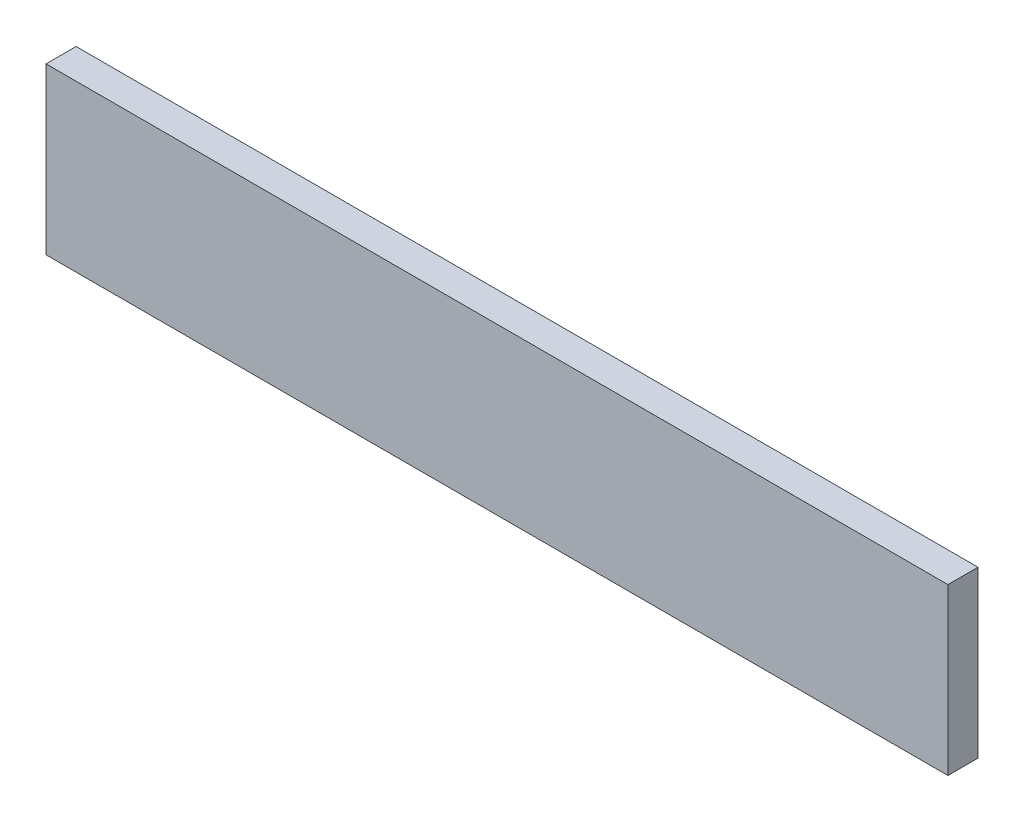
ISO-10303-21;
HEADER;
FILE_DESCRIPTION(('STEP AP214'),'2;1');
FILE_NAME('part.step','',(''),(''),'','','');
FILE_SCHEMA(('AUTOMOTIVE_DESIGN { 1 0 10303 214 1 1 1 1 }'));
ENDSEC;
DATA;
#1=APPLICATION_CONTEXT('core data for automotive mechanical design processes');
#2=APPLICATION_PROTOCOL_DEFINITION('international standard','automotive_design',2000,#1);
#3=PRODUCT_CONTEXT('',#1,'mechanical');
#4=PRODUCT('Part','Part','',(#3));
#5=PRODUCT_RELATED_PRODUCT_CATEGORY('part','',(#4));
#6=PRODUCT_DEFINITION_FORMATION('','',#4);
#7=PRODUCT_DEFINITION_CONTEXT('part definition',#1,'design');
#8=PRODUCT_DEFINITION('design','',#6,#7);
#9=PRODUCT_DEFINITION_SHAPE('','',#8);
#10=(LENGTH_UNIT() NAMED_UNIT(*) SI_UNIT(.MILLI.,.METRE.));
#11=(NAMED_UNIT(*) PLANE_ANGLE_UNIT() SI_UNIT($,.RADIAN.));
#12=(NAMED_UNIT(*) SI_UNIT($,.STERADIAN.) SOLID_ANGLE_UNIT());
#13=UNCERTAINTY_MEASURE_WITH_UNIT(LENGTH_MEASURE(1.E-05),#10,'distance_accuracy_value','');
#14=(GEOMETRIC_REPRESENTATION_CONTEXT(3) GLOBAL_UNCERTAINTY_ASSIGNED_CONTEXT((#13)) GLOBAL_UNIT_ASSIGNED_CONTEXT((#10,
#11,#12)) REPRESENTATION_CONTEXT('',''));
#15=CARTESIAN_POINT('',(0.,0.,0.));
#16=DIRECTION('',(0.,0.,1.));
#17=DIRECTION('',(1.,0.,0.));
#18=AXIS2_PLACEMENT_3D('',#15,#16,#17);
#19=CARTESIAN_POINT('',(95.25,-17.4625,3.175));
#20=DIRECTION('',(-1.,0.,0.));
#21=DIRECTION('',(0.,0.,1.));
#22=AXIS2_PLACEMENT_3D('',#19,#20,#21);
#23=PLANE('',#22);
#24=DIRECTION('',(0.,1.,0.));
#25=VECTOR('',#24,1.);
#26=CARTESIAN_POINT('',(95.25,-17.4625,-3.175));
#27=LINE('',#26,#25);
#28=CARTESIAN_POINT('',(95.25,-17.4625,-3.175));
#29=VERTEX_POINT('',#28);
#30=CARTESIAN_POINT('',(95.25,17.4625,-3.175));
#31=VERTEX_POINT('',#30);
#32=EDGE_CURVE('E96',#29,#31,#27,.T.);
#33=ORIENTED_EDGE('',*,*,#32,.T.);
#34=DIRECTION('',(0.,0.,-1.));
#35=VECTOR('',#34,1.);
#36=CARTESIAN_POINT('',(95.25,17.4625,3.175));
#37=LINE('',#36,#35);
#38=CARTESIAN_POINT('',(95.25,17.4625,3.175));
#39=VERTEX_POINT('',#38);
#40=EDGE_CURVE('E11',#39,#31,#37,.T.);
#41=ORIENTED_EDGE('',*,*,#40,.F.);
#42=DIRECTION('',(0.,1.,0.));
#43=VECTOR('',#42,1.);
#44=CARTESIAN_POINT('',(95.25,-17.4625,3.175));
#45=LINE('',#44,#43);
#46=CARTESIAN_POINT('',(95.25,-17.4625,3.175));
#47=VERTEX_POINT('',#46);
#48=EDGE_CURVE('E84',#47,#39,#45,.T.);
#49=ORIENTED_EDGE('',*,*,#48,.F.);
#50=DIRECTION('',(0.,0.,-1.));
#51=VECTOR('',#50,1.);
#52=CARTESIAN_POINT('',(95.25,-17.4625,3.175));
#53=LINE('',#52,#51);
#54=EDGE_CURVE('E92',#47,#29,#53,.T.);
#55=ORIENTED_EDGE('',*,*,#54,.T.);
#56=EDGE_LOOP('',(#33,#41,#49,#55));
#57=FACE_BOUND('',#56,.T.);
#58=ADVANCED_FACE('F33',(#57),#23,.F.);
#59=CARTESIAN_POINT('',(-95.25,17.4625,3.175));
#60=DIRECTION('',(0.,-1.,0.));
#61=DIRECTION('',(0.,0.,-1.));
#62=AXIS2_PLACEMENT_3D('',#59,#60,#61);
#63=PLANE('',#62);
#64=DIRECTION('',(-1.,0.,0.));
#65=VECTOR('',#64,1.);
#66=CARTESIAN_POINT('',(-95.25,17.4625,-3.175));
#67=LINE('',#66,#65);
#68=CARTESIAN_POINT('',(-95.25,17.4625,-3.175));
#69=VERTEX_POINT('',#68);
#70=EDGE_CURVE('E88',#31,#69,#67,.T.);
#71=ORIENTED_EDGE('',*,*,#70,.T.);
#72=DIRECTION('',(0.,0.,-1.));
#73=VECTOR('',#72,1.);
#74=CARTESIAN_POINT('',(-95.25,17.4625,3.175));
#75=LINE('',#74,#73);
#76=CARTESIAN_POINT('',(-95.25,17.4625,3.175));
#77=VERTEX_POINT('',#76);
#78=EDGE_CURVE('E41',#77,#69,#75,.T.);
#79=ORIENTED_EDGE('',*,*,#78,.F.);
#80=DIRECTION('',(-1.,0.,0.));
#81=VECTOR('',#80,1.);
#82=CARTESIAN_POINT('',(-95.25,17.4625,3.175));
#83=LINE('',#82,#81);
#84=EDGE_CURVE('E79',#39,#77,#83,.T.);
#85=ORIENTED_EDGE('',*,*,#84,.F.);
#86=ORIENTED_EDGE('',*,*,#40,.T.);
#87=EDGE_LOOP('',(#71,#79,#85,#86));
#88=FACE_BOUND('',#87,.T.);
#89=ADVANCED_FACE('F87',(#88),#63,.F.);
#90=CARTESIAN_POINT('',(-95.25,-17.4625,3.175));
#91=DIRECTION('',(1.,0.,0.));
#92=DIRECTION('',(0.,0.,-1.));
#93=AXIS2_PLACEMENT_3D('',#90,#91,#92);
#94=PLANE('',#93);
#95=DIRECTION('',(0.,-1.,0.));
#96=VECTOR('',#95,1.);
#97=CARTESIAN_POINT('',(-95.25,-17.4625,-3.175));
#98=LINE('',#97,#96);
#99=CARTESIAN_POINT('',(-95.25,-17.4625,-3.175));
#100=VERTEX_POINT('',#99);
#101=EDGE_CURVE('E66',#69,#100,#98,.T.);
#102=ORIENTED_EDGE('',*,*,#101,.T.);
#103=DIRECTION('',(0.,0.,-1.));
#104=VECTOR('',#103,1.);
#105=CARTESIAN_POINT('',(-95.25,-17.4625,3.175));
#106=LINE('',#105,#104);
#107=CARTESIAN_POINT('',(-95.25,-17.4625,3.175));
#108=VERTEX_POINT('',#107);
#109=EDGE_CURVE('E89',#108,#100,#106,.T.);
#110=ORIENTED_EDGE('',*,*,#109,.F.);
#111=DIRECTION('',(0.,-1.,0.));
#112=VECTOR('',#111,1.);
#113=CARTESIAN_POINT('',(-95.25,-17.4625,3.175));
#114=LINE('',#113,#112);
#115=EDGE_CURVE('E82',#77,#108,#114,.T.);
#116=ORIENTED_EDGE('',*,*,#115,.F.);
#117=ORIENTED_EDGE('',*,*,#78,.T.);
#118=EDGE_LOOP('',(#102,#110,#116,#117));
#119=FACE_BOUND('',#118,.T.);
#120=ADVANCED_FACE('F90',(#119),#94,.F.);
#121=CARTESIAN_POINT('',(-95.25,-17.4625,3.175));
#122=DIRECTION('',(0.,1.,0.));
#123=DIRECTION('',(0.,0.,1.));
#124=AXIS2_PLACEMENT_3D('',#121,#122,#123);
#125=PLANE('',#124);
#126=DIRECTION('',(1.,0.,0.));
#127=VECTOR('',#126,1.);
#128=CARTESIAN_POINT('',(-95.25,-17.4625,-3.175));
#129=LINE('',#128,#127);
#130=EDGE_CURVE('E72',#100,#29,#129,.T.);
#131=ORIENTED_EDGE('',*,*,#130,.T.);
#132=ORIENTED_EDGE('',*,*,#54,.F.);
#133=DIRECTION('',(1.,0.,0.));
#134=VECTOR('',#133,1.);
#135=CARTESIAN_POINT('',(-95.25,-17.4625,3.175));
#136=LINE('',#135,#134);
#137=EDGE_CURVE('E49',#108,#47,#136,.T.);
#138=ORIENTED_EDGE('',*,*,#137,.F.);
#139=ORIENTED_EDGE('',*,*,#109,.T.);
#140=EDGE_LOOP('',(#131,#132,#138,#139));
#141=FACE_BOUND('',#140,.T.);
#142=ADVANCED_FACE('F103',(#141),#125,.F.);
#143=CARTESIAN_POINT('',(0.,0.,3.175));
#144=DIRECTION('',(0.,0.,-1.));
#145=DIRECTION('',(-1.,0.,0.));
#146=AXIS2_PLACEMENT_3D('',#143,#144,#145);
#147=PLANE('',#146);
#148=ORIENTED_EDGE('',*,*,#48,.T.);
#149=ORIENTED_EDGE('',*,*,#84,.T.);
#150=ORIENTED_EDGE('',*,*,#115,.T.);
#151=ORIENTED_EDGE('',*,*,#137,.T.);
#152=EDGE_LOOP('',(#148,#149,#150,#151));
#153=FACE_BOUND('',#152,.T.);
#154=ADVANCED_FACE('F80',(#153),#147,.F.);
#155=CARTESIAN_POINT('',(0.,0.,-3.175));
#156=DIRECTION('',(0.,0.,-1.));
#157=DIRECTION('',(-1.,0.,0.));
#158=AXIS2_PLACEMENT_3D('',#155,#156,#157);
#159=PLANE('',#158);
#160=ORIENTED_EDGE('',*,*,#32,.F.);
#161=ORIENTED_EDGE('',*,*,#130,.F.);
#162=ORIENTED_EDGE('',*,*,#101,.F.);
#163=ORIENTED_EDGE('',*,*,#70,.F.);
#164=EDGE_LOOP('',(#160,#161,#162,#163));
#165=FACE_BOUND('',#164,.T.);
#166=ADVANCED_FACE('F106',(#165),#159,.T.);
#167=CLOSED_SHELL('',(#58,#89,#120,#142,#154,#166));
#168=MANIFOLD_SOLID_BREP('B2',#167);
#169=ADVANCED_BREP_SHAPE_REPRESENTATION('',(#18,#168),#14);
#170=SHAPE_DEFINITION_REPRESENTATION(#9,#169);
ENDSEC;
END-ISO-10303-21;
